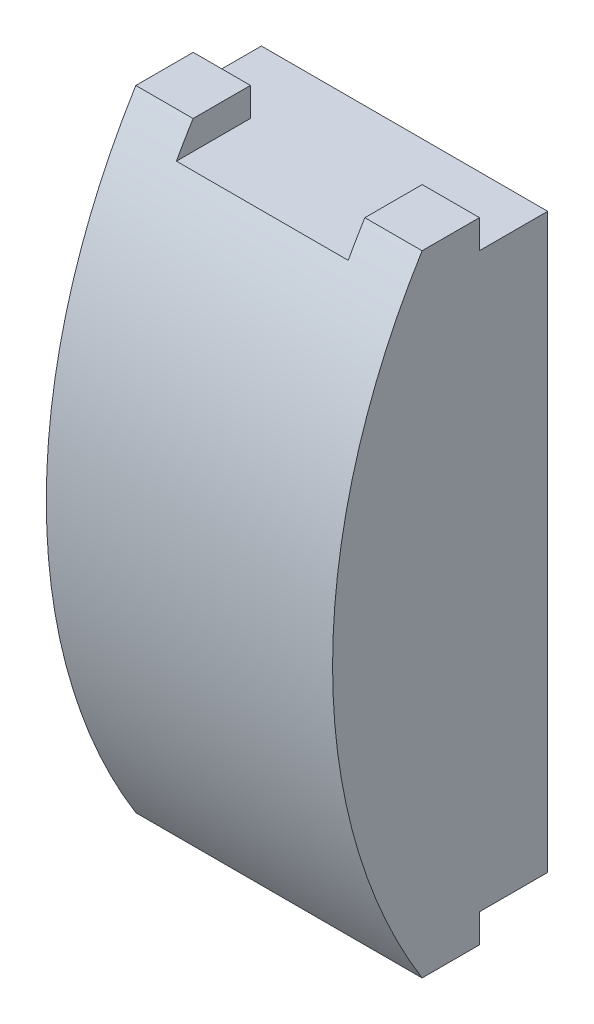
ISO-10303-21;
HEADER;
FILE_DESCRIPTION(('STEP AP214'),'2;1');
FILE_NAME('part.step','',(''),(''),'','','');
FILE_SCHEMA(('AUTOMOTIVE_DESIGN { 1 0 10303 214 1 1 1 1 }'));
ENDSEC;
DATA;
#1=APPLICATION_CONTEXT('core data for automotive mechanical design processes');
#2=APPLICATION_PROTOCOL_DEFINITION('international standard','automotive_design',2000,#1);
#3=PRODUCT_CONTEXT('',#1,'mechanical');
#4=PRODUCT('Part','Part','',(#3));
#5=PRODUCT_RELATED_PRODUCT_CATEGORY('part','',(#4));
#6=PRODUCT_DEFINITION_FORMATION('','',#4);
#7=PRODUCT_DEFINITION_CONTEXT('part definition',#1,'design');
#8=PRODUCT_DEFINITION('design','',#6,#7);
#9=PRODUCT_DEFINITION_SHAPE('','',#8);
#10=(LENGTH_UNIT() NAMED_UNIT(*) SI_UNIT(.MILLI.,.METRE.));
#11=(NAMED_UNIT(*) PLANE_ANGLE_UNIT() SI_UNIT($,.RADIAN.));
#12=(NAMED_UNIT(*) SI_UNIT($,.STERADIAN.) SOLID_ANGLE_UNIT());
#13=UNCERTAINTY_MEASURE_WITH_UNIT(LENGTH_MEASURE(1.E-05),#10,'distance_accuracy_value','');
#14=(GEOMETRIC_REPRESENTATION_CONTEXT(3) GLOBAL_UNCERTAINTY_ASSIGNED_CONTEXT((#13)) GLOBAL_UNIT_ASSIGNED_CONTEXT((#10,
#11,#12)) REPRESENTATION_CONTEXT('',''));
#15=CARTESIAN_POINT('',(0.,0.,0.));
#16=DIRECTION('',(0.,0.,1.));
#17=DIRECTION('',(1.,0.,0.));
#18=AXIS2_PLACEMENT_3D('',#15,#16,#17);
#19=CARTESIAN_POINT('',(-25.,55.,11.9183131088073));
#20=DIRECTION('',(0.,0.,-1.));
#21=DIRECTION('',(-1.,0.,0.));
#22=AXIS2_PLACEMENT_3D('',#19,#20,#21);
#23=PLANE('',#22);
#24=DIRECTION('',(0.,1.,0.));
#25=VECTOR('',#24,1.);
#26=CARTESIAN_POINT('',(-15.,55.,11.9183131088073));
#27=LINE('',#26,#25);
#28=CARTESIAN_POINT('',(-15.,50.,11.9183131088073));
#29=VERTEX_POINT('',#28);
#30=CARTESIAN_POINT('',(-15.,55.,11.9183131088073));
#31=VERTEX_POINT('',#30);
#32=EDGE_CURVE('E181',#29,#31,#27,.T.);
#33=ORIENTED_EDGE('',*,*,#32,.F.);
#34=DIRECTION('',(1.,0.,0.));
#35=VECTOR('',#34,1.);
#36=CARTESIAN_POINT('',(25.,50.,11.9183131088073));
#37=LINE('',#36,#35);
#38=CARTESIAN_POINT('',(-25.,50.,11.9183131088073));
#39=VERTEX_POINT('',#38);
#40=EDGE_CURVE('E126',#39,#29,#37,.T.);
#41=ORIENTED_EDGE('',*,*,#40,.F.);
#42=DIRECTION('',(0.,1.,0.));
#43=VECTOR('',#42,1.);
#44=CARTESIAN_POINT('',(-25.,55.,11.9183131088073));
#45=LINE('',#44,#43);
#46=CARTESIAN_POINT('',(-25.,55.,11.9183131088073));
#47=VERTEX_POINT('',#46);
#48=EDGE_CURVE('E210',#39,#47,#45,.T.);
#49=ORIENTED_EDGE('',*,*,#48,.T.);
#50=DIRECTION('',(1.,0.,0.));
#51=VECTOR('',#50,1.);
#52=CARTESIAN_POINT('',(-25.,55.,11.9183131088073));
#53=LINE('',#52,#51);
#54=EDGE_CURVE('E141',#47,#31,#53,.T.);
#55=ORIENTED_EDGE('',*,*,#54,.T.);
#56=EDGE_LOOP('',(#33,#41,#49,#55));
#57=FACE_BOUND('',#56,.T.);
#58=ADVANCED_FACE('F32',(#57),#23,.T.);
#59=CARTESIAN_POINT('',(-25.,55.,21.9367203161711));
#60=DIRECTION('',(0.,1.,0.));
#61=DIRECTION('',(0.,0.,1.));
#62=AXIS2_PLACEMENT_3D('',#59,#60,#61);
#63=PLANE('',#62);
#64=DIRECTION('',(0.,0.,1.));
#65=VECTOR('',#64,1.);
#66=CARTESIAN_POINT('',(-15.,55.,21.9367203161711));
#67=LINE('',#66,#65);
#68=CARTESIAN_POINT('',(-15.,55.,21.9367203161711));
#69=VERTEX_POINT('',#68);
#70=EDGE_CURVE('E40',#31,#69,#67,.T.);
#71=ORIENTED_EDGE('',*,*,#70,.F.);
#72=ORIENTED_EDGE('',*,*,#54,.F.);
#73=DIRECTION('',(0.,0.,1.));
#74=VECTOR('',#73,1.);
#75=CARTESIAN_POINT('',(-25.,55.,21.9367203161711));
#76=LINE('',#75,#74);
#77=CARTESIAN_POINT('',(-25.,55.,21.9367203161711));
#78=VERTEX_POINT('',#77);
#79=EDGE_CURVE('E193',#47,#78,#76,.T.);
#80=ORIENTED_EDGE('',*,*,#79,.T.);
#81=DIRECTION('',(1.,0.,0.));
#82=VECTOR('',#81,1.);
#83=CARTESIAN_POINT('',(-25.,55.,21.9367203161711));
#84=LINE('',#83,#82);
#85=EDGE_CURVE('E149',#78,#69,#84,.T.);
#86=ORIENTED_EDGE('',*,*,#85,.T.);
#87=EDGE_LOOP('',(#71,#72,#80,#86));
#88=FACE_BOUND('',#87,.T.);
#89=ADVANCED_FACE('F191',(#88),#63,.T.);
#90=CARTESIAN_POINT('',(-25.,-50.,20.));
#91=DIRECTION('',(1.,0.,0.));
#92=DIRECTION('',(0.,0.,-1.));
#93=AXIS2_PLACEMENT_3D('',#90,#91,#92);
#94=PLANE('',#93);
#95=DIRECTION('',(0.,0.,-1.));
#96=VECTOR('',#95,1.);
#97=CARTESIAN_POINT('',(-25.,-50.,20.));
#98=LINE('',#97,#96);
#99=CARTESIAN_POINT('',(-25.,-50.,11.9183131088073));
#100=VERTEX_POINT('',#99);
#101=CARTESIAN_POINT('',(-25.,-50.,0.));
#102=VERTEX_POINT('',#101);
#103=EDGE_CURVE('E172',#100,#102,#98,.T.);
#104=ORIENTED_EDGE('',*,*,#103,.F.);
#105=CARTESIAN_POINT('',(-25.,-55.,11.9183131088073));
#106=VERTEX_POINT('',#105);
#107=EDGE_CURVE('E218',#106,#100,#45,.T.);
#108=ORIENTED_EDGE('',*,*,#107,.F.);
#109=DIRECTION('',(0.,0.,-1.));
#110=VECTOR('',#109,1.);
#111=CARTESIAN_POINT('',(-25.,-55.,21.9367203161711));
#112=LINE('',#111,#110);
#113=CARTESIAN_POINT('',(-25.,-55.,21.9367203161711));
#114=VERTEX_POINT('',#113);
#115=EDGE_CURVE('E207',#114,#106,#112,.T.);
#116=ORIENTED_EDGE('',*,*,#115,.F.);
#117=CARTESIAN_POINT('',(-25.,0.,-66.9973335419501));
#118=DIRECTION('',(1.,0.,0.));
#119=DIRECTION('',(0.,0.,-1.));
#120=AXIS2_PLACEMENT_3D('',#117,#118,#119);
#121=CIRCLE('',#120,104.567040388639);
#122=EDGE_CURVE('E146',#78,#114,#121,.T.);
#123=ORIENTED_EDGE('',*,*,#122,.F.);
#124=ORIENTED_EDGE('',*,*,#79,.F.);
#125=ORIENTED_EDGE('',*,*,#48,.F.);
#126=DIRECTION('',(0.,0.,-1.));
#127=VECTOR('',#126,1.);
#128=CARTESIAN_POINT('',(-25.,50.,20.));
#129=LINE('',#128,#127);
#130=CARTESIAN_POINT('',(-25.,50.,0.));
#131=VERTEX_POINT('',#130);
#132=EDGE_CURVE('E165',#39,#131,#129,.T.);
#133=ORIENTED_EDGE('',*,*,#132,.T.);
#134=DIRECTION('',(0.,-1.,0.));
#135=VECTOR('',#134,1.);
#136=CARTESIAN_POINT('',(-25.,-50.,0.));
#137=LINE('',#136,#135);
#138=EDGE_CURVE('E153',#131,#102,#137,.T.);
#139=ORIENTED_EDGE('',*,*,#138,.T.);
#140=EDGE_LOOP('',(#104,#108,#116,#123,#124,#125,#133,#139));
#141=FACE_BOUND('',#140,.T.);
#142=ADVANCED_FACE('F34',(#141),#94,.F.);
#143=CARTESIAN_POINT('',(25.,-50.,20.));
#144=DIRECTION('',(0.,1.,0.));
#145=DIRECTION('',(-1.,0.,0.));
#146=AXIS2_PLACEMENT_3D('',#143,#144,#145);
#147=PLANE('',#146);
#148=DIRECTION('',(0.,0.,-1.));
#149=VECTOR('',#148,1.);
#150=CARTESIAN_POINT('',(25.,-50.,20.));
#151=LINE('',#150,#149);
#152=CARTESIAN_POINT('',(25.,-50.,11.9183131088073));
#153=VERTEX_POINT('',#152);
#154=CARTESIAN_POINT('',(25.,-50.,0.));
#155=VERTEX_POINT('',#154);
#156=EDGE_CURVE('E170',#153,#155,#151,.T.);
#157=ORIENTED_EDGE('',*,*,#156,.F.);
#158=DIRECTION('',(-1.,0.,0.));
#159=VECTOR('',#158,1.);
#160=CARTESIAN_POINT('',(25.,-50.,11.9183131088073));
#161=LINE('',#160,#159);
#162=EDGE_CURVE('E55',#153,#100,#161,.T.);
#163=ORIENTED_EDGE('',*,*,#162,.T.);
#164=ORIENTED_EDGE('',*,*,#103,.T.);
#165=DIRECTION('',(1.,0.,0.));
#166=VECTOR('',#165,1.);
#167=CARTESIAN_POINT('',(25.,-50.,0.));
#168=LINE('',#167,#166);
#169=EDGE_CURVE('E157',#102,#155,#168,.T.);
#170=ORIENTED_EDGE('',*,*,#169,.T.);
#171=EDGE_LOOP('',(#157,#163,#164,#170));
#172=FACE_BOUND('',#171,.T.);
#173=ADVANCED_FACE('F238',(#172),#147,.F.);
#174=CARTESIAN_POINT('',(25.,-50.,20.));
#175=DIRECTION('',(-1.,0.,0.));
#176=DIRECTION('',(0.,0.,1.));
#177=AXIS2_PLACEMENT_3D('',#174,#175,#176);
#178=PLANE('',#177);
#179=DIRECTION('',(0.,1.,0.));
#180=VECTOR('',#179,1.);
#181=CARTESIAN_POINT('',(25.,55.,11.9183131088073));
#182=LINE('',#181,#180);
#183=CARTESIAN_POINT('',(25.,-55.,11.9183131088073));
#184=VERTEX_POINT('',#183);
#185=EDGE_CURVE('E204',#184,#153,#182,.T.);
#186=ORIENTED_EDGE('',*,*,#185,.T.);
#187=ORIENTED_EDGE('',*,*,#156,.T.);
#188=DIRECTION('',(0.,1.,0.));
#189=VECTOR('',#188,1.);
#190=CARTESIAN_POINT('',(25.,-50.,0.));
#191=LINE('',#190,#189);
#192=CARTESIAN_POINT('',(25.,50.,0.));
#193=VERTEX_POINT('',#192);
#194=EDGE_CURVE('E160',#155,#193,#191,.T.);
#195=ORIENTED_EDGE('',*,*,#194,.T.);
#196=DIRECTION('',(0.,0.,-1.));
#197=VECTOR('',#196,1.);
#198=CARTESIAN_POINT('',(25.,50.,20.));
#199=LINE('',#198,#197);
#200=CARTESIAN_POINT('',(25.,50.,11.9183131088073));
#201=VERTEX_POINT('',#200);
#202=EDGE_CURVE('E168',#201,#193,#199,.T.);
#203=ORIENTED_EDGE('',*,*,#202,.F.);
#204=CARTESIAN_POINT('',(25.,55.,11.9183131088073));
#205=VERTEX_POINT('',#204);
#206=EDGE_CURVE('E203',#201,#205,#182,.T.);
#207=ORIENTED_EDGE('',*,*,#206,.T.);
#208=DIRECTION('',(0.,0.,1.));
#209=VECTOR('',#208,1.);
#210=CARTESIAN_POINT('',(25.,55.,21.9367203161711));
#211=LINE('',#210,#209);
#212=CARTESIAN_POINT('',(25.,55.,21.9367203161711));
#213=VERTEX_POINT('',#212);
#214=EDGE_CURVE('E140',#205,#213,#211,.T.);
#215=ORIENTED_EDGE('',*,*,#214,.T.);
#216=CARTESIAN_POINT('',(25.,0.,-66.9973335419501));
#217=DIRECTION('',(1.,0.,0.));
#218=DIRECTION('',(0.,0.,-1.));
#219=AXIS2_PLACEMENT_3D('',#216,#217,#218);
#220=CIRCLE('',#219,104.567040388639);
#221=CARTESIAN_POINT('',(25.,-55.,21.9367203161711));
#222=VERTEX_POINT('',#221);
#223=EDGE_CURVE('E201',#213,#222,#220,.T.);
#224=ORIENTED_EDGE('',*,*,#223,.T.);
#225=DIRECTION('',(0.,0.,-1.));
#226=VECTOR('',#225,1.);
#227=CARTESIAN_POINT('',(25.,-55.,21.9367203161711));
#228=LINE('',#227,#226);
#229=EDGE_CURVE('E214',#222,#184,#228,.T.);
#230=ORIENTED_EDGE('',*,*,#229,.T.);
#231=EDGE_LOOP('',(#186,#187,#195,#203,#207,#215,#224,#230));
#232=FACE_BOUND('',#231,.T.);
#233=ADVANCED_FACE('F199',(#232),#178,.F.);
#234=CARTESIAN_POINT('',(25.,50.,20.));
#235=DIRECTION('',(0.,-1.,0.));
#236=DIRECTION('',(0.,0.,-1.));
#237=AXIS2_PLACEMENT_3D('',#234,#235,#236);
#238=PLANE('',#237);
#239=DIRECTION('',(-1.,0.,0.));
#240=VECTOR('',#239,1.);
#241=CARTESIAN_POINT('',(25.,50.,0.));
#242=LINE('',#241,#240);
#243=EDGE_CURVE('E163',#193,#131,#242,.T.);
#244=ORIENTED_EDGE('',*,*,#243,.T.);
#245=ORIENTED_EDGE('',*,*,#132,.F.);
#246=ORIENTED_EDGE('',*,*,#40,.T.);
#247=DIRECTION('',(0.,0.,-1.));
#248=VECTOR('',#247,1.);
#249=CARTESIAN_POINT('',(-15.,50.,30.));
#250=LINE('',#249,#248);
#251=CARTESIAN_POINT('',(-15.,50.,24.8409261085856));
#252=VERTEX_POINT('',#251);
#253=EDGE_CURVE('E223',#252,#29,#250,.T.);
#254=ORIENTED_EDGE('',*,*,#253,.F.);
#255=DIRECTION('',(1.,0.,0.));
#256=VECTOR('',#255,1.);
#257=CARTESIAN_POINT('',(-25.,50.,24.8409261085856));
#258=LINE('',#257,#256);
#259=CARTESIAN_POINT('',(15.,50.,24.8409261085856));
#260=VERTEX_POINT('',#259);
#261=EDGE_CURVE('E11',#252,#260,#258,.T.);
#262=ORIENTED_EDGE('',*,*,#261,.T.);
#263=DIRECTION('',(0.,0.,-1.));
#264=VECTOR('',#263,1.);
#265=CARTESIAN_POINT('',(15.,50.,30.));
#266=LINE('',#265,#264);
#267=CARTESIAN_POINT('',(15.,50.,11.9183131088073));
#268=VERTEX_POINT('',#267);
#269=EDGE_CURVE('E224',#260,#268,#266,.T.);
#270=ORIENTED_EDGE('',*,*,#269,.T.);
#271=EDGE_CURVE('E134',#268,#201,#37,.T.);
#272=ORIENTED_EDGE('',*,*,#271,.T.);
#273=ORIENTED_EDGE('',*,*,#202,.T.);
#274=EDGE_LOOP('',(#244,#245,#246,#254,#262,#270,#272,#273));
#275=FACE_BOUND('',#274,.T.);
#276=ADVANCED_FACE('F230',(#275),#238,.F.);
#277=CARTESIAN_POINT('',(0.,0.,0.));
#278=DIRECTION('',(0.,0.,1.));
#279=DIRECTION('',(1.,0.,0.));
#280=AXIS2_PLACEMENT_3D('',#277,#278,#279);
#281=PLANE('',#280);
#282=ORIENTED_EDGE('',*,*,#138,.F.);
#283=ORIENTED_EDGE('',*,*,#243,.F.);
#284=ORIENTED_EDGE('',*,*,#194,.F.);
#285=ORIENTED_EDGE('',*,*,#169,.F.);
#286=EDGE_LOOP('',(#282,#283,#284,#285));
#287=FACE_BOUND('',#286,.T.);
#288=ADVANCED_FACE('F236',(#287),#281,.F.);
#289=ORIENTED_EDGE('',*,*,#162,.F.);
#290=ORIENTED_EDGE('',*,*,#185,.F.);
#291=DIRECTION('',(1.,0.,0.));
#292=VECTOR('',#291,1.);
#293=CARTESIAN_POINT('',(-25.,-55.,11.9183131088073));
#294=LINE('',#293,#292);
#295=EDGE_CURVE('E142',#106,#184,#294,.T.);
#296=ORIENTED_EDGE('',*,*,#295,.F.);
#297=ORIENTED_EDGE('',*,*,#107,.T.);
#298=EDGE_LOOP('',(#289,#290,#296,#297));
#299=FACE_BOUND('',#298,.T.);
#300=ADVANCED_FACE('F242',(#299),#23,.T.);
#301=DIRECTION('',(0.,-1.,0.));
#302=VECTOR('',#301,1.);
#303=CARTESIAN_POINT('',(15.,55.,11.9183131088073));
#304=LINE('',#303,#302);
#305=CARTESIAN_POINT('',(15.,55.,11.9183131088073));
#306=VERTEX_POINT('',#305);
#307=EDGE_CURVE('E121',#306,#268,#304,.T.);
#308=ORIENTED_EDGE('',*,*,#307,.F.);
#309=EDGE_CURVE('E132',#306,#205,#53,.T.);
#310=ORIENTED_EDGE('',*,*,#309,.T.);
#311=ORIENTED_EDGE('',*,*,#206,.F.);
#312=ORIENTED_EDGE('',*,*,#271,.F.);
#313=EDGE_LOOP('',(#308,#310,#311,#312));
#314=FACE_BOUND('',#313,.T.);
#315=ADVANCED_FACE('F130',(#314),#23,.T.);
#316=CARTESIAN_POINT('',(-25.,-55.,21.9367203161711));
#317=DIRECTION('',(0.,-1.,0.));
#318=DIRECTION('',(0.,0.,-1.));
#319=AXIS2_PLACEMENT_3D('',#316,#317,#318);
#320=PLANE('',#319);
#321=ORIENTED_EDGE('',*,*,#229,.F.);
#322=DIRECTION('',(1.,0.,0.));
#323=VECTOR('',#322,1.);
#324=CARTESIAN_POINT('',(-25.,-55.,21.9367203161711));
#325=LINE('',#324,#323);
#326=EDGE_CURVE('E154',#114,#222,#325,.T.);
#327=ORIENTED_EDGE('',*,*,#326,.F.);
#328=ORIENTED_EDGE('',*,*,#115,.T.);
#329=ORIENTED_EDGE('',*,*,#295,.T.);
#330=EDGE_LOOP('',(#321,#327,#328,#329));
#331=FACE_BOUND('',#330,.T.);
#332=ADVANCED_FACE('F245',(#331),#320,.T.);
#333=CARTESIAN_POINT('',(-25.,0.,-66.9973335419501));
#334=DIRECTION('',(1.,0.,0.));
#335=DIRECTION('',(0.,0.,-1.));
#336=AXIS2_PLACEMENT_3D('',#333,#334,#335);
#337=CYLINDRICAL_SURFACE('',#336,104.567040388639);
#338=CARTESIAN_POINT('',(-15.,0.,-66.9973335419501));
#339=DIRECTION('',(-1.,0.,0.));
#340=DIRECTION('',(0.,-1.,0.));
#341=AXIS2_PLACEMENT_3D('',#338,#339,#340);
#342=CIRCLE('',#341,104.567040388639);
#343=EDGE_CURVE('E135',#69,#252,#342,.F.);
#344=ORIENTED_EDGE('',*,*,#343,.F.);
#345=ORIENTED_EDGE('',*,*,#85,.F.);
#346=ORIENTED_EDGE('',*,*,#122,.T.);
#347=ORIENTED_EDGE('',*,*,#326,.T.);
#348=ORIENTED_EDGE('',*,*,#223,.F.);
#349=CARTESIAN_POINT('',(15.,55.,21.9367203161711));
#350=VERTEX_POINT('',#349);
#351=EDGE_CURVE('E145',#350,#213,#84,.T.);
#352=ORIENTED_EDGE('',*,*,#351,.F.);
#353=CARTESIAN_POINT('',(14.9999999999999,0.,-66.9973335419501));
#354=DIRECTION('',(1.,0.,0.));
#355=DIRECTION('',(0.,1.,0.));
#356=AXIS2_PLACEMENT_3D('',#353,#354,#355);
#357=CIRCLE('',#356,104.567040388639);
#358=EDGE_CURVE('E47',#260,#350,#357,.F.);
#359=ORIENTED_EDGE('',*,*,#358,.F.);
#360=ORIENTED_EDGE('',*,*,#261,.F.);
#361=EDGE_LOOP('',(#344,#345,#346,#347,#348,#352,#359,#360));
#362=FACE_BOUND('',#361,.T.);
#363=ADVANCED_FACE('F187',(#362),#337,.T.);
#364=DIRECTION('',(0.,0.,-1.));
#365=VECTOR('',#364,1.);
#366=CARTESIAN_POINT('',(15.,55.,21.9367203161711));
#367=LINE('',#366,#365);
#368=EDGE_CURVE('E118',#350,#306,#367,.T.);
#369=ORIENTED_EDGE('',*,*,#368,.F.);
#370=ORIENTED_EDGE('',*,*,#351,.T.);
#371=ORIENTED_EDGE('',*,*,#214,.F.);
#372=ORIENTED_EDGE('',*,*,#309,.F.);
#373=EDGE_LOOP('',(#369,#370,#371,#372));
#374=FACE_BOUND('',#373,.T.);
#375=ADVANCED_FACE('F138',(#374),#63,.T.);
#376=CARTESIAN_POINT('',(-15.,55.,30.));
#377=DIRECTION('',(-1.,0.,0.));
#378=DIRECTION('',(0.,-1.,0.));
#379=AXIS2_PLACEMENT_3D('',#376,#377,#378);
#380=PLANE('',#379);
#381=ORIENTED_EDGE('',*,*,#32,.T.);
#382=ORIENTED_EDGE('',*,*,#70,.T.);
#383=ORIENTED_EDGE('',*,*,#343,.T.);
#384=ORIENTED_EDGE('',*,*,#253,.T.);
#385=EDGE_LOOP('',(#381,#382,#383,#384));
#386=FACE_BOUND('',#385,.T.);
#387=ADVANCED_FACE('F178',(#386),#380,.F.);
#388=CARTESIAN_POINT('',(15.,55.,30.));
#389=DIRECTION('',(1.,0.,0.));
#390=DIRECTION('',(0.,1.,0.));
#391=AXIS2_PLACEMENT_3D('',#388,#389,#390);
#392=PLANE('',#391);
#393=ORIENTED_EDGE('',*,*,#307,.T.);
#394=ORIENTED_EDGE('',*,*,#269,.F.);
#395=ORIENTED_EDGE('',*,*,#358,.T.);
#396=ORIENTED_EDGE('',*,*,#368,.T.);
#397=EDGE_LOOP('',(#393,#394,#395,#396));
#398=FACE_BOUND('',#397,.T.);
#399=ADVANCED_FACE('F120',(#398),#392,.F.);
#400=CLOSED_SHELL('',(#58,#89,#142,#173,#233,#276,#288,#300,#315,#332,#363,#375,#387,#399));
#401=MANIFOLD_SOLID_BREP('B2',#400);
#402=ADVANCED_BREP_SHAPE_REPRESENTATION('',(#18,#401),#14);
#403=SHAPE_DEFINITION_REPRESENTATION(#9,#402);
ENDSEC;
END-ISO-10303-21;
